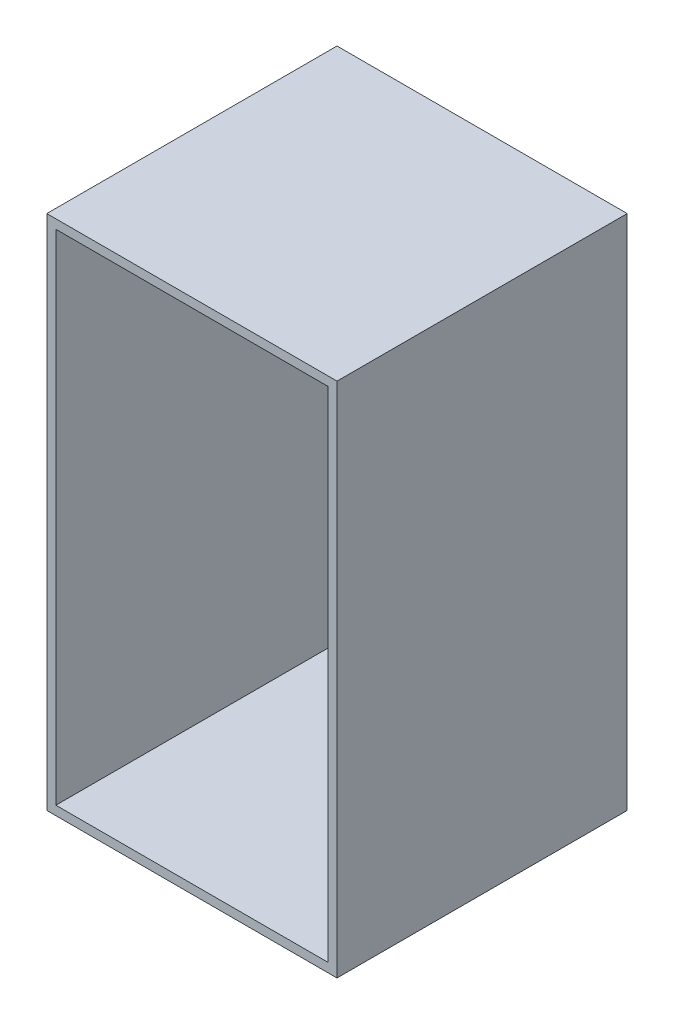
ISO-10303-21;
HEADER;
FILE_DESCRIPTION(('STEP AP214'),'2;1');
FILE_NAME('part.step','',(''),(''),'','','');
FILE_SCHEMA(('AUTOMOTIVE_DESIGN { 1 0 10303 214 1 1 1 1 }'));
ENDSEC;
DATA;
#1=APPLICATION_CONTEXT('core data for automotive mechanical design processes');
#2=APPLICATION_PROTOCOL_DEFINITION('international standard','automotive_design',2000,#1);
#3=PRODUCT_CONTEXT('',#1,'mechanical');
#4=PRODUCT('Part','Part','',(#3));
#5=PRODUCT_RELATED_PRODUCT_CATEGORY('part','',(#4));
#6=PRODUCT_DEFINITION_FORMATION('','',#4);
#7=PRODUCT_DEFINITION_CONTEXT('part definition',#1,'design');
#8=PRODUCT_DEFINITION('design','',#6,#7);
#9=PRODUCT_DEFINITION_SHAPE('','',#8);
#10=(LENGTH_UNIT() NAMED_UNIT(*) SI_UNIT(.MILLI.,.METRE.));
#11=(NAMED_UNIT(*) PLANE_ANGLE_UNIT() SI_UNIT($,.RADIAN.));
#12=(NAMED_UNIT(*) SI_UNIT($,.STERADIAN.) SOLID_ANGLE_UNIT());
#13=UNCERTAINTY_MEASURE_WITH_UNIT(LENGTH_MEASURE(1.E-05),#10,'distance_accuracy_value','');
#14=(GEOMETRIC_REPRESENTATION_CONTEXT(3) GLOBAL_UNCERTAINTY_ASSIGNED_CONTEXT((#13)) GLOBAL_UNIT_ASSIGNED_CONTEXT((#10,
#11,#12)) REPRESENTATION_CONTEXT('',''));
#15=CARTESIAN_POINT('',(0.,0.,0.));
#16=DIRECTION('',(0.,0.,1.));
#17=DIRECTION('',(1.,0.,0.));
#18=AXIS2_PLACEMENT_3D('',#15,#16,#17);
#19=CARTESIAN_POINT('',(0.,0.,640.));
#20=DIRECTION('',(0.,0.,-1.));
#21=DIRECTION('',(-1.,0.,0.));
#22=AXIS2_PLACEMENT_3D('',#19,#20,#21);
#23=PLANE('',#22);
#24=DIRECTION('',(0.,1.,0.));
#25=VECTOR('',#24,1.);
#26=CARTESIAN_POINT('',(320.,-570.,640.));
#27=LINE('',#26,#25);
#28=CARTESIAN_POINT('',(320.,-570.,640.));
#29=VERTEX_POINT('',#28);
#30=CARTESIAN_POINT('',(320.,570.,640.));
#31=VERTEX_POINT('',#30);
#32=EDGE_CURVE('E157',#29,#31,#27,.T.);
#33=ORIENTED_EDGE('',*,*,#32,.T.);
#34=DIRECTION('',(-1.,0.,0.));
#35=VECTOR('',#34,1.);
#36=CARTESIAN_POINT('',(-320.,570.,640.));
#37=LINE('',#36,#35);
#38=CARTESIAN_POINT('',(-320.,570.,640.));
#39=VERTEX_POINT('',#38);
#40=EDGE_CURVE('E92',#31,#39,#37,.T.);
#41=ORIENTED_EDGE('',*,*,#40,.T.);
#42=DIRECTION('',(0.,-1.,0.));
#43=VECTOR('',#42,1.);
#44=CARTESIAN_POINT('',(-320.,-570.,640.));
#45=LINE('',#44,#43);
#46=CARTESIAN_POINT('',(-320.,-570.,640.));
#47=VERTEX_POINT('',#46);
#48=EDGE_CURVE('E162',#39,#47,#45,.T.);
#49=ORIENTED_EDGE('',*,*,#48,.T.);
#50=DIRECTION('',(1.,0.,0.));
#51=VECTOR('',#50,1.);
#52=CARTESIAN_POINT('',(-320.,-570.,640.));
#53=LINE('',#52,#51);
#54=EDGE_CURVE('E64',#47,#29,#53,.T.);
#55=ORIENTED_EDGE('',*,*,#54,.T.);
#56=EDGE_LOOP('',(#33,#41,#49,#55));
#57=FACE_BOUND('',#56,.T.);
#58=DIRECTION('',(0.,1.,0.));
#59=VECTOR('',#58,1.);
#60=CARTESIAN_POINT('',(300.,0.,640.));
#61=LINE('',#60,#59);
#62=CARTESIAN_POINT('',(300.,-550.,640.));
#63=VERTEX_POINT('',#62);
#64=CARTESIAN_POINT('',(300.,550.,640.));
#65=VERTEX_POINT('',#64);
#66=EDGE_CURVE('E141',#63,#65,#61,.T.);
#67=ORIENTED_EDGE('',*,*,#66,.F.);
#68=DIRECTION('',(1.,0.,0.));
#69=VECTOR('',#68,1.);
#70=CARTESIAN_POINT('',(0.,-550.,640.));
#71=LINE('',#70,#69);
#72=CARTESIAN_POINT('',(-300.,-550.,640.));
#73=VERTEX_POINT('',#72);
#74=EDGE_CURVE('E154',#73,#63,#71,.T.);
#75=ORIENTED_EDGE('',*,*,#74,.F.);
#76=DIRECTION('',(0.,-1.,0.));
#77=VECTOR('',#76,1.);
#78=CARTESIAN_POINT('',(-300.,0.,640.));
#79=LINE('',#78,#77);
#80=CARTESIAN_POINT('',(-300.,550.,640.));
#81=VERTEX_POINT('',#80);
#82=EDGE_CURVE('E151',#81,#73,#79,.T.);
#83=ORIENTED_EDGE('',*,*,#82,.F.);
#84=DIRECTION('',(-1.,0.,0.));
#85=VECTOR('',#84,1.);
#86=CARTESIAN_POINT('',(0.,550.,640.));
#87=LINE('',#86,#85);
#88=EDGE_CURVE('E130',#65,#81,#87,.T.);
#89=ORIENTED_EDGE('',*,*,#88,.F.);
#90=EDGE_LOOP('',(#67,#75,#83,#89));
#91=FACE_BOUND('',#90,.T.);
#92=ADVANCED_FACE('F39',(#57,#91),#23,.F.);
#93=CARTESIAN_POINT('',(320.,-570.,640.));
#94=DIRECTION('',(-1.,0.,0.));
#95=DIRECTION('',(0.,0.,1.));
#96=AXIS2_PLACEMENT_3D('',#93,#94,#95);
#97=PLANE('',#96);
#98=DIRECTION('',(0.,1.,0.));
#99=VECTOR('',#98,1.);
#100=CARTESIAN_POINT('',(320.,-570.,0.));
#101=LINE('',#100,#99);
#102=CARTESIAN_POINT('',(320.,-570.,0.));
#103=VERTEX_POINT('',#102);
#104=CARTESIAN_POINT('',(320.,570.,0.));
#105=VERTEX_POINT('',#104);
#106=EDGE_CURVE('E168',#103,#105,#101,.T.);
#107=ORIENTED_EDGE('',*,*,#106,.T.);
#108=DIRECTION('',(0.,0.,-1.));
#109=VECTOR('',#108,1.);
#110=CARTESIAN_POINT('',(320.,570.,640.));
#111=LINE('',#110,#109);
#112=EDGE_CURVE('E11',#31,#105,#111,.T.);
#113=ORIENTED_EDGE('',*,*,#112,.F.);
#114=ORIENTED_EDGE('',*,*,#32,.F.);
#115=DIRECTION('',(0.,0.,-1.));
#116=VECTOR('',#115,1.);
#117=CARTESIAN_POINT('',(320.,-570.,640.));
#118=LINE('',#117,#116);
#119=EDGE_CURVE('E167',#29,#103,#118,.T.);
#120=ORIENTED_EDGE('',*,*,#119,.T.);
#121=EDGE_LOOP('',(#107,#113,#114,#120));
#122=FACE_BOUND('',#121,.T.);
#123=ADVANCED_FACE('F41',(#122),#97,.F.);
#124=CARTESIAN_POINT('',(-320.,570.,640.));
#125=DIRECTION('',(0.,-1.,0.));
#126=DIRECTION('',(0.,0.,-1.));
#127=AXIS2_PLACEMENT_3D('',#124,#125,#126);
#128=PLANE('',#127);
#129=DIRECTION('',(-1.,0.,0.));
#130=VECTOR('',#129,1.);
#131=CARTESIAN_POINT('',(-320.,570.,0.));
#132=LINE('',#131,#130);
#133=CARTESIAN_POINT('',(-320.,570.,0.));
#134=VERTEX_POINT('',#133);
#135=EDGE_CURVE('E172',#105,#134,#132,.T.);
#136=ORIENTED_EDGE('',*,*,#135,.T.);
#137=DIRECTION('',(0.,0.,-1.));
#138=VECTOR('',#137,1.);
#139=CARTESIAN_POINT('',(-320.,570.,640.));
#140=LINE('',#139,#138);
#141=EDGE_CURVE('E48',#39,#134,#140,.T.);
#142=ORIENTED_EDGE('',*,*,#141,.F.);
#143=ORIENTED_EDGE('',*,*,#40,.F.);
#144=ORIENTED_EDGE('',*,*,#112,.T.);
#145=EDGE_LOOP('',(#136,#142,#143,#144));
#146=FACE_BOUND('',#145,.T.);
#147=ADVANCED_FACE('F206',(#146),#128,.F.);
#148=CARTESIAN_POINT('',(-320.,-570.,640.));
#149=DIRECTION('',(1.,0.,0.));
#150=DIRECTION('',(0.,0.,-1.));
#151=AXIS2_PLACEMENT_3D('',#148,#149,#150);
#152=PLANE('',#151);
#153=DIRECTION('',(0.,-1.,0.));
#154=VECTOR('',#153,1.);
#155=CARTESIAN_POINT('',(-320.,-570.,0.));
#156=LINE('',#155,#154);
#157=CARTESIAN_POINT('',(-320.,-570.,0.));
#158=VERTEX_POINT('',#157);
#159=EDGE_CURVE('E175',#134,#158,#156,.T.);
#160=ORIENTED_EDGE('',*,*,#159,.T.);
#161=DIRECTION('',(0.,0.,-1.));
#162=VECTOR('',#161,1.);
#163=CARTESIAN_POINT('',(-320.,-570.,640.));
#164=LINE('',#163,#162);
#165=EDGE_CURVE('E182',#47,#158,#164,.T.);
#166=ORIENTED_EDGE('',*,*,#165,.F.);
#167=ORIENTED_EDGE('',*,*,#48,.F.);
#168=ORIENTED_EDGE('',*,*,#141,.T.);
#169=EDGE_LOOP('',(#160,#166,#167,#168));
#170=FACE_BOUND('',#169,.T.);
#171=ADVANCED_FACE('F189',(#170),#152,.F.);
#172=CARTESIAN_POINT('',(-320.,-570.,640.));
#173=DIRECTION('',(0.,1.,0.));
#174=DIRECTION('',(0.,0.,1.));
#175=AXIS2_PLACEMENT_3D('',#172,#173,#174);
#176=PLANE('',#175);
#177=DIRECTION('',(1.,0.,0.));
#178=VECTOR('',#177,1.);
#179=CARTESIAN_POINT('',(-320.,-570.,0.));
#180=LINE('',#179,#178);
#181=EDGE_CURVE('E85',#158,#103,#180,.T.);
#182=ORIENTED_EDGE('',*,*,#181,.T.);
#183=ORIENTED_EDGE('',*,*,#119,.F.);
#184=ORIENTED_EDGE('',*,*,#54,.F.);
#185=ORIENTED_EDGE('',*,*,#165,.T.);
#186=EDGE_LOOP('',(#182,#183,#184,#185));
#187=FACE_BOUND('',#186,.T.);
#188=ADVANCED_FACE('F197',(#187),#176,.F.);
#189=CARTESIAN_POINT('',(0.,0.,0.));
#190=DIRECTION('',(0.,0.,-1.));
#191=DIRECTION('',(-1.,0.,0.));
#192=AXIS2_PLACEMENT_3D('',#189,#190,#191);
#193=PLANE('',#192);
#194=ORIENTED_EDGE('',*,*,#106,.F.);
#195=ORIENTED_EDGE('',*,*,#181,.F.);
#196=ORIENTED_EDGE('',*,*,#159,.F.);
#197=ORIENTED_EDGE('',*,*,#135,.F.);
#198=EDGE_LOOP('',(#194,#195,#196,#197));
#199=FACE_BOUND('',#198,.T.);
#200=ADVANCED_FACE('F193',(#199),#193,.T.);
#201=CARTESIAN_POINT('',(300.,-570.,640.));
#202=DIRECTION('',(-1.,0.,0.));
#203=DIRECTION('',(0.,0.,1.));
#204=AXIS2_PLACEMENT_3D('',#201,#202,#203);
#205=PLANE('',#204);
#206=DIRECTION('',(0.,1.,0.));
#207=VECTOR('',#206,1.);
#208=CARTESIAN_POINT('',(300.,0.,20.));
#209=LINE('',#208,#207);
#210=CARTESIAN_POINT('',(300.,-550.,20.));
#211=VERTEX_POINT('',#210);
#212=CARTESIAN_POINT('',(300.,550.,20.));
#213=VERTEX_POINT('',#212);
#214=EDGE_CURVE('E120',#211,#213,#209,.T.);
#215=ORIENTED_EDGE('',*,*,#214,.F.);
#216=DIRECTION('',(0.,0.,-1.));
#217=VECTOR('',#216,1.);
#218=CARTESIAN_POINT('',(300.,-550.,640.));
#219=LINE('',#218,#217);
#220=EDGE_CURVE('E145',#63,#211,#219,.T.);
#221=ORIENTED_EDGE('',*,*,#220,.F.);
#222=ORIENTED_EDGE('',*,*,#66,.T.);
#223=DIRECTION('',(0.,0.,-1.));
#224=VECTOR('',#223,1.);
#225=CARTESIAN_POINT('',(300.,550.,640.));
#226=LINE('',#225,#224);
#227=EDGE_CURVE('E134',#65,#213,#226,.T.);
#228=ORIENTED_EDGE('',*,*,#227,.T.);
#229=EDGE_LOOP('',(#215,#221,#222,#228));
#230=FACE_BOUND('',#229,.T.);
#231=ADVANCED_FACE('F204',(#230),#205,.T.);
#232=CARTESIAN_POINT('',(-320.,550.,640.));
#233=DIRECTION('',(0.,-1.,0.));
#234=DIRECTION('',(0.,0.,-1.));
#235=AXIS2_PLACEMENT_3D('',#232,#233,#234);
#236=PLANE('',#235);
#237=DIRECTION('',(-1.,0.,0.));
#238=VECTOR('',#237,1.);
#239=CARTESIAN_POINT('',(0.,550.,20.));
#240=LINE('',#239,#238);
#241=CARTESIAN_POINT('',(-300.,550.,20.));
#242=VERTEX_POINT('',#241);
#243=EDGE_CURVE('E114',#213,#242,#240,.T.);
#244=ORIENTED_EDGE('',*,*,#243,.F.);
#245=ORIENTED_EDGE('',*,*,#227,.F.);
#246=ORIENTED_EDGE('',*,*,#88,.T.);
#247=DIRECTION('',(0.,0.,-1.));
#248=VECTOR('',#247,1.);
#249=CARTESIAN_POINT('',(-300.,550.,640.));
#250=LINE('',#249,#248);
#251=EDGE_CURVE('E127',#81,#242,#250,.T.);
#252=ORIENTED_EDGE('',*,*,#251,.T.);
#253=EDGE_LOOP('',(#244,#245,#246,#252));
#254=FACE_BOUND('',#253,.T.);
#255=ADVANCED_FACE('F128',(#254),#236,.T.);
#256=CARTESIAN_POINT('',(-300.,-570.,640.));
#257=DIRECTION('',(1.,0.,0.));
#258=DIRECTION('',(0.,0.,-1.));
#259=AXIS2_PLACEMENT_3D('',#256,#257,#258);
#260=PLANE('',#259);
#261=DIRECTION('',(0.,-1.,0.));
#262=VECTOR('',#261,1.);
#263=CARTESIAN_POINT('',(-300.,0.,20.));
#264=LINE('',#263,#262);
#265=CARTESIAN_POINT('',(-300.,-550.,20.));
#266=VERTEX_POINT('',#265);
#267=EDGE_CURVE('E118',#242,#266,#264,.T.);
#268=ORIENTED_EDGE('',*,*,#267,.F.);
#269=ORIENTED_EDGE('',*,*,#251,.F.);
#270=ORIENTED_EDGE('',*,*,#82,.T.);
#271=DIRECTION('',(0.,0.,-1.));
#272=VECTOR('',#271,1.);
#273=CARTESIAN_POINT('',(-300.,-550.,640.));
#274=LINE('',#273,#272);
#275=EDGE_CURVE('E55',#73,#266,#274,.T.);
#276=ORIENTED_EDGE('',*,*,#275,.T.);
#277=EDGE_LOOP('',(#268,#269,#270,#276));
#278=FACE_BOUND('',#277,.T.);
#279=ADVANCED_FACE('F136',(#278),#260,.T.);
#280=CARTESIAN_POINT('',(-320.,-550.,640.));
#281=DIRECTION('',(0.,1.,0.));
#282=DIRECTION('',(0.,0.,1.));
#283=AXIS2_PLACEMENT_3D('',#280,#281,#282);
#284=PLANE('',#283);
#285=DIRECTION('',(1.,0.,0.));
#286=VECTOR('',#285,1.);
#287=CARTESIAN_POINT('',(0.,-550.,20.));
#288=LINE('',#287,#286);
#289=EDGE_CURVE('E138',#266,#211,#288,.T.);
#290=ORIENTED_EDGE('',*,*,#289,.F.);
#291=ORIENTED_EDGE('',*,*,#275,.F.);
#292=ORIENTED_EDGE('',*,*,#74,.T.);
#293=ORIENTED_EDGE('',*,*,#220,.T.);
#294=EDGE_LOOP('',(#290,#291,#292,#293));
#295=FACE_BOUND('',#294,.T.);
#296=ADVANCED_FACE('F217',(#295),#284,.T.);
#297=CARTESIAN_POINT('',(0.,0.,20.));
#298=DIRECTION('',(0.,0.,-1.));
#299=DIRECTION('',(-1.,0.,0.));
#300=AXIS2_PLACEMENT_3D('',#297,#298,#299);
#301=PLANE('',#300);
#302=ORIENTED_EDGE('',*,*,#214,.T.);
#303=ORIENTED_EDGE('',*,*,#243,.T.);
#304=ORIENTED_EDGE('',*,*,#267,.T.);
#305=ORIENTED_EDGE('',*,*,#289,.T.);
#306=EDGE_LOOP('',(#302,#303,#304,#305));
#307=FACE_BOUND('',#306,.T.);
#308=ADVANCED_FACE('F116',(#307),#301,.F.);
#309=CLOSED_SHELL('',(#92,#123,#147,#171,#188,#200,#231,#255,#279,#296,#308));
#310=MANIFOLD_SOLID_BREP('B2',#309);
#311=ADVANCED_BREP_SHAPE_REPRESENTATION('',(#18,#310),#14);
#312=SHAPE_DEFINITION_REPRESENTATION(#9,#311);
ENDSEC;
END-ISO-10303-21;
